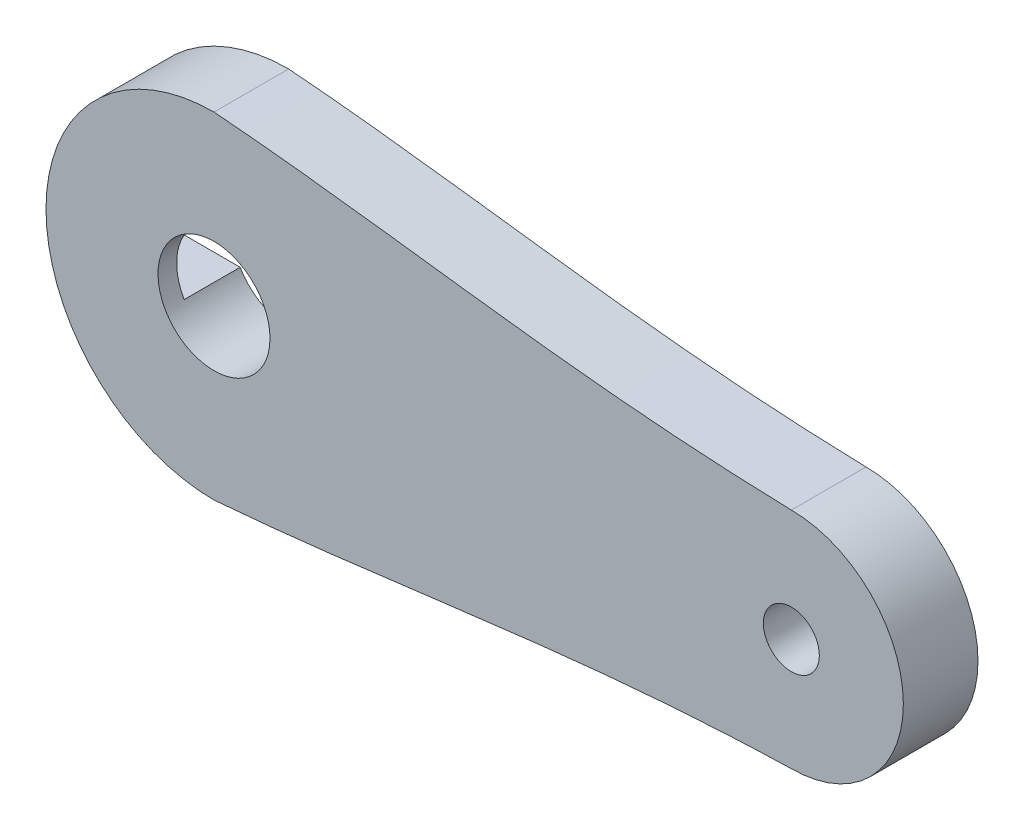
ISO-10303-21;
HEADER;
FILE_DESCRIPTION(('STEP AP214'),'2;1');
FILE_NAME('part.step','',(''),(''),'','','');
FILE_SCHEMA(('AUTOMOTIVE_DESIGN { 1 0 10303 214 1 1 1 1 }'));
ENDSEC;
DATA;
#1=APPLICATION_CONTEXT('core data for automotive mechanical design processes');
#2=APPLICATION_PROTOCOL_DEFINITION('international standard','automotive_design',2000,#1);
#3=PRODUCT_CONTEXT('',#1,'mechanical');
#4=PRODUCT('Part','Part','',(#3));
#5=PRODUCT_RELATED_PRODUCT_CATEGORY('part','',(#4));
#6=PRODUCT_DEFINITION_FORMATION('','',#4);
#7=PRODUCT_DEFINITION_CONTEXT('part definition',#1,'design');
#8=PRODUCT_DEFINITION('design','',#6,#7);
#9=PRODUCT_DEFINITION_SHAPE('','',#8);
#10=(LENGTH_UNIT() NAMED_UNIT(*) SI_UNIT(.MILLI.,.METRE.));
#11=(NAMED_UNIT(*) PLANE_ANGLE_UNIT() SI_UNIT($,.RADIAN.));
#12=(NAMED_UNIT(*) SI_UNIT($,.STERADIAN.) SOLID_ANGLE_UNIT());
#13=UNCERTAINTY_MEASURE_WITH_UNIT(LENGTH_MEASURE(1.E-05),#10,'distance_accuracy_value','');
#14=(GEOMETRIC_REPRESENTATION_CONTEXT(3) GLOBAL_UNCERTAINTY_ASSIGNED_CONTEXT((#13)) GLOBAL_UNIT_ASSIGNED_CONTEXT((#10,
#11,#12)) REPRESENTATION_CONTEXT('',''));
#15=CARTESIAN_POINT('',(0.,0.,0.));
#16=DIRECTION('',(0.,0.,1.));
#17=DIRECTION('',(1.,0.,0.));
#18=AXIS2_PLACEMENT_3D('',#15,#16,#17);
#19=CARTESIAN_POINT('',(14.6671745113369,7.31875759675215,0.));
#20=DIRECTION('',(0.,0.,1.));
#21=DIRECTION('',(1.,0.,0.));
#22=AXIS2_PLACEMENT_3D('',#19,#20,#21);
#23=PLANE('',#22);
#24=CARTESIAN_POINT('',(30.93,6.,0.));
#25=CARTESIAN_POINT('',(18.6898856465054,6.32824950480552,0.));
#26=CARTESIAN_POINT('',(10.1125797170595,8.18843741986687,0.));
#27=CARTESIAN_POINT('',(0.,9.,0.));
#28=B_SPLINE_CURVE_WITH_KNOTS('',3,(#24,#25,#26,#27),.UNSPECIFIED.,.F.,.F.,(4,4),(0.,1.),.UNSPECIFIED.);
#29=CARTESIAN_POINT('',(30.93,6.,0.));
#30=VERTEX_POINT('',#29);
#31=CARTESIAN_POINT('',(0.,9.,0.));
#32=VERTEX_POINT('',#31);
#33=EDGE_CURVE('E176',#30,#32,#28,.T.);
#34=ORIENTED_EDGE('',*,*,#33,.F.);
#35=CARTESIAN_POINT('',(30.93,0.,0.));
#36=DIRECTION('',(0.,0.,1.));
#37=DIRECTION('',(1.,0.,0.));
#38=AXIS2_PLACEMENT_3D('',#35,#36,#37);
#39=CIRCLE('',#38,6.);
#40=CARTESIAN_POINT('',(30.93,-6.,0.));
#41=VERTEX_POINT('',#40);
#42=EDGE_CURVE('E186',#41,#30,#39,.T.);
#43=ORIENTED_EDGE('',*,*,#42,.F.);
#44=CARTESIAN_POINT('',(0.,-9.,0.));
#45=CARTESIAN_POINT('',(10.1125797170595,-8.18843741986687,0.));
#46=CARTESIAN_POINT('',(18.6898856465054,-6.32824950480552,0.));
#47=CARTESIAN_POINT('',(30.93,-6.,0.));
#48=B_SPLINE_CURVE_WITH_KNOTS('',3,(#44,#45,#46,#47),.UNSPECIFIED.,.F.,.F.,(4,4),(0.,1.),.UNSPECIFIED.);
#49=CARTESIAN_POINT('',(0.,-9.,0.));
#50=VERTEX_POINT('',#49);
#51=EDGE_CURVE('E338',#50,#41,#48,.T.);
#52=ORIENTED_EDGE('',*,*,#51,.F.);
#53=CARTESIAN_POINT('',(0.,0.,0.));
#54=DIRECTION('',(0.,0.,1.));
#55=DIRECTION('',(1.,0.,0.));
#56=AXIS2_PLACEMENT_3D('',#53,#54,#55);
#57=CIRCLE('',#56,9.);
#58=EDGE_CURVE('E343',#32,#50,#57,.T.);
#59=ORIENTED_EDGE('',*,*,#58,.F.);
#60=EDGE_LOOP('',(#34,#43,#52,#59));
#61=FACE_BOUND('',#60,.T.);
#62=CARTESIAN_POINT('',(30.93,0.,0.));
#63=DIRECTION('',(0.,0.,1.));
#64=DIRECTION('',(1.,0.,0.));
#65=AXIS2_PLACEMENT_3D('',#62,#63,#64);
#66=CIRCLE('',#65,1.5);
#67=CARTESIAN_POINT('',(32.43,0.,0.));
#68=VERTEX_POINT('',#67);
#69=EDGE_CURVE('E137',#68,#68,#66,.T.);
#70=ORIENTED_EDGE('',*,*,#69,.T.);
#71=EDGE_LOOP('',(#70));
#72=FACE_BOUND('',#71,.T.);
#73=DIRECTION('',(-1.,0.,0.));
#74=VECTOR('',#73,1.);
#75=CARTESIAN_POINT('',(-2.59807621135333,1.5,0.));
#76=LINE('',#75,#74);
#77=CARTESIAN_POINT('',(-2.59807621135333,1.5,0.));
#78=VERTEX_POINT('',#77);
#79=CARTESIAN_POINT('',(-7.,1.5,0.));
#80=VERTEX_POINT('',#79);
#81=EDGE_CURVE('E154',#78,#80,#76,.T.);
#82=ORIENTED_EDGE('',*,*,#81,.T.);
#83=DIRECTION('',(0.,-1.,0.));
#84=VECTOR('',#83,1.);
#85=CARTESIAN_POINT('',(-7.,1.5,0.));
#86=LINE('',#85,#84);
#87=CARTESIAN_POINT('',(-7.,-1.5,0.));
#88=VERTEX_POINT('',#87);
#89=EDGE_CURVE('E135',#80,#88,#86,.T.);
#90=ORIENTED_EDGE('',*,*,#89,.T.);
#91=DIRECTION('',(1.,0.,0.));
#92=VECTOR('',#91,1.);
#93=CARTESIAN_POINT('',(-7.,-1.5,0.));
#94=LINE('',#93,#92);
#95=CARTESIAN_POINT('',(-2.59807621135333,-1.5,0.));
#96=VERTEX_POINT('',#95);
#97=EDGE_CURVE('E157',#88,#96,#94,.T.);
#98=ORIENTED_EDGE('',*,*,#97,.T.);
#99=CARTESIAN_POINT('',(0.,0.,0.));
#100=DIRECTION('',(0.,0.,1.));
#101=DIRECTION('',(1.,0.,0.));
#102=AXIS2_PLACEMENT_3D('',#99,#100,#101);
#103=CIRCLE('',#102,3.00000000000001);
#104=CARTESIAN_POINT('',(2.59807621135333,-1.5,0.));
#105=VERTEX_POINT('',#104);
#106=EDGE_CURVE('E170',#96,#105,#103,.T.);
#107=ORIENTED_EDGE('',*,*,#106,.T.);
#108=CARTESIAN_POINT('',(8.99999999999999,-1.5,0.));
#109=VERTEX_POINT('',#108);
#110=EDGE_CURVE('E156',#105,#109,#94,.T.);
#111=ORIENTED_EDGE('',*,*,#110,.T.);
#112=DIRECTION('',(0.,1.,0.));
#113=VECTOR('',#112,1.);
#114=CARTESIAN_POINT('',(8.99999999999999,-1.5,0.));
#115=LINE('',#114,#113);
#116=CARTESIAN_POINT('',(8.99999999999999,1.5,0.));
#117=VERTEX_POINT('',#116);
#118=EDGE_CURVE('E128',#109,#117,#115,.T.);
#119=ORIENTED_EDGE('',*,*,#118,.T.);
#120=CARTESIAN_POINT('',(2.59807621135333,1.5,0.));
#121=VERTEX_POINT('',#120);
#122=EDGE_CURVE('E151',#117,#121,#76,.T.);
#123=ORIENTED_EDGE('',*,*,#122,.T.);
#124=EDGE_CURVE('E177',#121,#78,#103,.T.);
#125=ORIENTED_EDGE('',*,*,#124,.T.);
#126=EDGE_LOOP('',(#82,#90,#98,#107,#111,#119,#123,#125));
#127=FACE_BOUND('',#126,.T.);
#128=ADVANCED_FACE('F34',(#61,#72,#127),#23,.F.);
#129=CARTESIAN_POINT('',(0.,0.,4.));
#130=DIRECTION('',(0.,0.,-1.));
#131=DIRECTION('',(-1.,0.,0.));
#132=AXIS2_PLACEMENT_3D('',#129,#130,#131);
#133=CYLINDRICAL_SURFACE('',#132,3.00000000000001);
#134=CARTESIAN_POINT('',(0.,0.,4.));
#135=DIRECTION('',(0.,0.,1.));
#136=DIRECTION('',(1.,0.,0.));
#137=AXIS2_PLACEMENT_3D('',#134,#135,#136);
#138=CIRCLE('',#137,3.00000000000001);
#139=CARTESIAN_POINT('',(3.00000000000001,0.,4.));
#140=VERTEX_POINT('',#139);
#141=EDGE_CURVE('E173',#140,#140,#138,.T.);
#142=ORIENTED_EDGE('',*,*,#141,.T.);
#143=EDGE_LOOP('',(#142));
#144=FACE_BOUND('',#143,.T.);
#145=CARTESIAN_POINT('',(0.,0.,3.));
#146=DIRECTION('',(0.,0.,1.));
#147=DIRECTION('',(1.,0.,0.));
#148=AXIS2_PLACEMENT_3D('',#145,#146,#147);
#149=CIRCLE('',#148,3.00000000000001);
#150=CARTESIAN_POINT('',(-2.59807621135333,1.5,3.));
#151=VERTEX_POINT('',#150);
#152=CARTESIAN_POINT('',(-2.59807621135333,-1.5,3.));
#153=VERTEX_POINT('',#152);
#154=EDGE_CURVE('E367',#151,#153,#149,.T.);
#155=ORIENTED_EDGE('',*,*,#154,.F.);
#156=DIRECTION('',(0.,0.,-1.));
#157=VECTOR('',#156,1.);
#158=CARTESIAN_POINT('',(-2.59807621135333,1.5,4.));
#159=LINE('',#158,#157);
#160=EDGE_CURVE('E11',#151,#78,#159,.T.);
#161=ORIENTED_EDGE('',*,*,#160,.T.);
#162=ORIENTED_EDGE('',*,*,#124,.F.);
#163=DIRECTION('',(0.,0.,-1.));
#164=VECTOR('',#163,1.);
#165=CARTESIAN_POINT('',(2.59807621135333,1.5,4.));
#166=LINE('',#165,#164);
#167=CARTESIAN_POINT('',(2.59807621135332,1.5,3.));
#168=VERTEX_POINT('',#167);
#169=EDGE_CURVE('E370',#121,#168,#166,.F.);
#170=ORIENTED_EDGE('',*,*,#169,.T.);
#171=CARTESIAN_POINT('',(2.59807621135333,-1.5,3.));
#172=VERTEX_POINT('',#171);
#173=EDGE_CURVE('E364',#172,#168,#149,.T.);
#174=ORIENTED_EDGE('',*,*,#173,.F.);
#175=DIRECTION('',(0.,0.,-1.));
#176=VECTOR('',#175,1.);
#177=CARTESIAN_POINT('',(2.59807621135333,-1.5,4.));
#178=LINE('',#177,#176);
#179=EDGE_CURVE('E366',#172,#105,#178,.T.);
#180=ORIENTED_EDGE('',*,*,#179,.T.);
#181=ORIENTED_EDGE('',*,*,#106,.F.);
#182=DIRECTION('',(0.,0.,-1.));
#183=VECTOR('',#182,1.);
#184=CARTESIAN_POINT('',(-2.59807621135333,-1.5,4.));
#185=LINE('',#184,#183);
#186=EDGE_CURVE('E43',#96,#153,#185,.F.);
#187=ORIENTED_EDGE('',*,*,#186,.T.);
#188=EDGE_LOOP('',(#155,#161,#162,#170,#174,#180,#181,#187));
#189=FACE_BOUND('',#188,.T.);
#190=ADVANCED_FACE('F217',(#144,#189),#133,.F.);
#191=CARTESIAN_POINT('',(14.6671745113369,7.31875759675215,4.));
#192=DIRECTION('',(0.,0.,1.));
#193=DIRECTION('',(1.,0.,0.));
#194=AXIS2_PLACEMENT_3D('',#191,#192,#193);
#195=PLANE('',#194);
#196=ORIENTED_EDGE('',*,*,#141,.F.);
#197=EDGE_LOOP('',(#196));
#198=FACE_BOUND('',#197,.T.);
#199=CARTESIAN_POINT('',(30.93,6.,4.));
#200=CARTESIAN_POINT('',(18.6898856465054,6.32824950480552,4.));
#201=CARTESIAN_POINT('',(10.1125797170595,8.18843741986687,4.));
#202=CARTESIAN_POINT('',(0.,9.,4.));
#203=B_SPLINE_CURVE_WITH_KNOTS('',3,(#199,#200,#201,#202),.UNSPECIFIED.,.F.,.F.,(4,4),(0.,1.),.UNSPECIFIED.);
#204=CARTESIAN_POINT('',(30.93,6.,4.));
#205=VERTEX_POINT('',#204);
#206=CARTESIAN_POINT('',(0.,9.,4.));
#207=VERTEX_POINT('',#206);
#208=EDGE_CURVE('E179',#205,#207,#203,.T.);
#209=ORIENTED_EDGE('',*,*,#208,.T.);
#210=CARTESIAN_POINT('',(0.,0.,4.));
#211=DIRECTION('',(0.,0.,1.));
#212=DIRECTION('',(1.,0.,0.));
#213=AXIS2_PLACEMENT_3D('',#210,#211,#212);
#214=CIRCLE('',#213,9.);
#215=CARTESIAN_POINT('',(0.,-9.,4.));
#216=VERTEX_POINT('',#215);
#217=EDGE_CURVE('E185',#207,#216,#214,.T.);
#218=ORIENTED_EDGE('',*,*,#217,.T.);
#219=CARTESIAN_POINT('',(0.,-9.,4.));
#220=CARTESIAN_POINT('',(10.1125797170595,-8.18843741986687,4.));
#221=CARTESIAN_POINT('',(18.6898856465054,-6.32824950480552,4.));
#222=CARTESIAN_POINT('',(30.93,-6.,4.));
#223=B_SPLINE_CURVE_WITH_KNOTS('',3,(#219,#220,#221,#222),.UNSPECIFIED.,.F.,.F.,(4,4),(0.,1.),.UNSPECIFIED.);
#224=CARTESIAN_POINT('',(30.93,-6.,4.));
#225=VERTEX_POINT('',#224);
#226=EDGE_CURVE('E191',#216,#225,#223,.T.);
#227=ORIENTED_EDGE('',*,*,#226,.T.);
#228=CARTESIAN_POINT('',(30.93,0.,4.));
#229=DIRECTION('',(0.,0.,1.));
#230=DIRECTION('',(1.,0.,0.));
#231=AXIS2_PLACEMENT_3D('',#228,#229,#230);
#232=CIRCLE('',#231,6.);
#233=EDGE_CURVE('E196',#225,#205,#232,.T.);
#234=ORIENTED_EDGE('',*,*,#233,.T.);
#235=EDGE_LOOP('',(#209,#218,#227,#234));
#236=FACE_BOUND('',#235,.T.);
#237=CARTESIAN_POINT('',(30.93,0.,4.));
#238=DIRECTION('',(0.,0.,1.));
#239=DIRECTION('',(1.,0.,0.));
#240=AXIS2_PLACEMENT_3D('',#237,#238,#239);
#241=CIRCLE('',#240,1.5);
#242=CARTESIAN_POINT('',(32.43,0.,4.));
#243=VERTEX_POINT('',#242);
#244=EDGE_CURVE('E167',#243,#243,#241,.T.);
#245=ORIENTED_EDGE('',*,*,#244,.F.);
#246=EDGE_LOOP('',(#245));
#247=FACE_BOUND('',#246,.T.);
#248=ADVANCED_FACE('F214',(#198,#236,#247),#195,.T.);
#249=DIRECTION('',(0.,0.,-1.));
#250=VECTOR('',#249,1.);
#251=SURFACE_OF_LINEAR_EXTRUSION('',#203,#250);
#252=ORIENTED_EDGE('',*,*,#33,.T.);
#253=DIRECTION('',(0.,0.,-1.));
#254=VECTOR('',#253,1.);
#255=CARTESIAN_POINT('',(0.,9.,4.));
#256=LINE('',#255,#254);
#257=EDGE_CURVE('E362',#207,#32,#256,.T.);
#258=ORIENTED_EDGE('',*,*,#257,.F.);
#259=ORIENTED_EDGE('',*,*,#208,.F.);
#260=DIRECTION('',(0.,0.,-1.));
#261=VECTOR('',#260,1.);
#262=CARTESIAN_POINT('',(30.93,6.,4.));
#263=LINE('',#262,#261);
#264=EDGE_CURVE('E333',#205,#30,#263,.T.);
#265=ORIENTED_EDGE('',*,*,#264,.T.);
#266=EDGE_LOOP('',(#252,#258,#259,#265));
#267=FACE_BOUND('',#266,.T.);
#268=ADVANCED_FACE('F36',(#267),#251,.F.);
#269=CARTESIAN_POINT('',(0.,0.,4.));
#270=DIRECTION('',(0.,0.,-1.));
#271=DIRECTION('',(-1.,0.,0.));
#272=AXIS2_PLACEMENT_3D('',#269,#270,#271);
#273=CYLINDRICAL_SURFACE('',#272,9.);
#274=ORIENTED_EDGE('',*,*,#58,.T.);
#275=DIRECTION('',(0.,0.,-1.));
#276=VECTOR('',#275,1.);
#277=CARTESIAN_POINT('',(0.,-9.,4.));
#278=LINE('',#277,#276);
#279=EDGE_CURVE('E359',#216,#50,#278,.T.);
#280=ORIENTED_EDGE('',*,*,#279,.F.);
#281=ORIENTED_EDGE('',*,*,#217,.F.);
#282=ORIENTED_EDGE('',*,*,#257,.T.);
#283=EDGE_LOOP('',(#274,#280,#281,#282));
#284=FACE_BOUND('',#283,.T.);
#285=ADVANCED_FACE('F206',(#284),#273,.T.);
#286=DIRECTION('',(0.,0.,-1.));
#287=VECTOR('',#286,1.);
#288=SURFACE_OF_LINEAR_EXTRUSION('',#223,#287);
#289=ORIENTED_EDGE('',*,*,#51,.T.);
#290=DIRECTION('',(0.,0.,-1.));
#291=VECTOR('',#290,1.);
#292=CARTESIAN_POINT('',(30.93,-6.,4.));
#293=LINE('',#292,#291);
#294=EDGE_CURVE('E336',#225,#41,#293,.T.);
#295=ORIENTED_EDGE('',*,*,#294,.F.);
#296=ORIENTED_EDGE('',*,*,#226,.F.);
#297=ORIENTED_EDGE('',*,*,#279,.T.);
#298=EDGE_LOOP('',(#289,#295,#296,#297));
#299=FACE_BOUND('',#298,.T.);
#300=ADVANCED_FACE('F202',(#299),#288,.F.);
#301=CARTESIAN_POINT('',(30.93,0.,4.));
#302=DIRECTION('',(0.,0.,-1.));
#303=DIRECTION('',(-1.,0.,0.));
#304=AXIS2_PLACEMENT_3D('',#301,#302,#303);
#305=CYLINDRICAL_SURFACE('',#304,6.);
#306=ORIENTED_EDGE('',*,*,#42,.T.);
#307=ORIENTED_EDGE('',*,*,#264,.F.);
#308=ORIENTED_EDGE('',*,*,#233,.F.);
#309=ORIENTED_EDGE('',*,*,#294,.T.);
#310=EDGE_LOOP('',(#306,#307,#308,#309));
#311=FACE_BOUND('',#310,.T.);
#312=ADVANCED_FACE('F205',(#311),#305,.T.);
#313=CARTESIAN_POINT('',(30.93,0.,4.));
#314=DIRECTION('',(0.,0.,-1.));
#315=DIRECTION('',(-1.,0.,0.));
#316=AXIS2_PLACEMENT_3D('',#313,#314,#315);
#317=CYLINDRICAL_SURFACE('',#316,1.5);
#318=ORIENTED_EDGE('',*,*,#244,.T.);
#319=EDGE_LOOP('',(#318));
#320=FACE_BOUND('',#319,.T.);
#321=ORIENTED_EDGE('',*,*,#69,.F.);
#322=EDGE_LOOP('',(#321));
#323=FACE_BOUND('',#322,.T.);
#324=ADVANCED_FACE('F230',(#320,#323),#317,.F.);
#325=CARTESIAN_POINT('',(0.,0.,3.));
#326=DIRECTION('',(0.,0.,1.));
#327=DIRECTION('',(1.,0.,0.));
#328=AXIS2_PLACEMENT_3D('',#325,#326,#327);
#329=PLANE('',#328);
#330=ORIENTED_EDGE('',*,*,#173,.T.);
#331=DIRECTION('',(-1.,0.,0.));
#332=VECTOR('',#331,1.);
#333=CARTESIAN_POINT('',(8.99999999999999,1.5,3.));
#334=LINE('',#333,#332);
#335=CARTESIAN_POINT('',(8.99999999999999,1.5,3.));
#336=VERTEX_POINT('',#335);
#337=EDGE_CURVE('E127',#336,#168,#334,.T.);
#338=ORIENTED_EDGE('',*,*,#337,.F.);
#339=DIRECTION('',(0.,1.,0.));
#340=VECTOR('',#339,1.);
#341=CARTESIAN_POINT('',(8.99999999999999,-1.5,3.));
#342=LINE('',#341,#340);
#343=CARTESIAN_POINT('',(8.99999999999999,-1.5,3.));
#344=VERTEX_POINT('',#343);
#345=EDGE_CURVE('E148',#344,#336,#342,.T.);
#346=ORIENTED_EDGE('',*,*,#345,.F.);
#347=DIRECTION('',(1.,0.,0.));
#348=VECTOR('',#347,1.);
#349=CARTESIAN_POINT('',(-7.,-1.5,3.));
#350=LINE('',#349,#348);
#351=EDGE_CURVE('E58',#172,#344,#350,.T.);
#352=ORIENTED_EDGE('',*,*,#351,.F.);
#353=EDGE_LOOP('',(#330,#338,#346,#352));
#354=FACE_BOUND('',#353,.T.);
#355=ADVANCED_FACE('F233',(#354),#329,.F.);
#356=CARTESIAN_POINT('',(-7.,-1.5,3.));
#357=DIRECTION('',(0.,1.,0.));
#358=DIRECTION('',(0.,0.,1.));
#359=AXIS2_PLACEMENT_3D('',#356,#357,#358);
#360=PLANE('',#359);
#361=ORIENTED_EDGE('',*,*,#351,.T.);
#362=DIRECTION('',(0.,0.,-1.));
#363=VECTOR('',#362,1.);
#364=CARTESIAN_POINT('',(8.99999999999999,-1.5,3.));
#365=LINE('',#364,#363);
#366=EDGE_CURVE('E164',#344,#109,#365,.T.);
#367=ORIENTED_EDGE('',*,*,#366,.T.);
#368=ORIENTED_EDGE('',*,*,#110,.F.);
#369=ORIENTED_EDGE('',*,*,#179,.F.);
#370=EDGE_LOOP('',(#361,#367,#368,#369));
#371=FACE_BOUND('',#370,.T.);
#372=ADVANCED_FACE('F239',(#371),#360,.T.);
#373=CARTESIAN_POINT('',(-2.59807621135333,1.5,3.));
#374=DIRECTION('',(0.,-1.,0.));
#375=DIRECTION('',(0.,0.,-1.));
#376=AXIS2_PLACEMENT_3D('',#373,#374,#375);
#377=PLANE('',#376);
#378=ORIENTED_EDGE('',*,*,#122,.F.);
#379=DIRECTION('',(0.,0.,-1.));
#380=VECTOR('',#379,1.);
#381=CARTESIAN_POINT('',(8.99999999999999,1.5,3.));
#382=LINE('',#381,#380);
#383=EDGE_CURVE('E150',#336,#117,#382,.T.);
#384=ORIENTED_EDGE('',*,*,#383,.F.);
#385=ORIENTED_EDGE('',*,*,#337,.T.);
#386=ORIENTED_EDGE('',*,*,#169,.F.);
#387=EDGE_LOOP('',(#378,#384,#385,#386));
#388=FACE_BOUND('',#387,.T.);
#389=ADVANCED_FACE('F235',(#388),#377,.T.);
#390=CARTESIAN_POINT('',(8.99999999999999,-1.5,3.));
#391=DIRECTION('',(-1.,0.,0.));
#392=DIRECTION('',(0.,0.,1.));
#393=AXIS2_PLACEMENT_3D('',#390,#391,#392);
#394=PLANE('',#393);
#395=ORIENTED_EDGE('',*,*,#118,.F.);
#396=ORIENTED_EDGE('',*,*,#366,.F.);
#397=ORIENTED_EDGE('',*,*,#345,.T.);
#398=ORIENTED_EDGE('',*,*,#383,.T.);
#399=EDGE_LOOP('',(#395,#396,#397,#398));
#400=FACE_BOUND('',#399,.T.);
#401=ADVANCED_FACE('F238',(#400),#394,.T.);
#402=CARTESIAN_POINT('',(-7.,1.5,3.));
#403=VERTEX_POINT('',#402);
#404=EDGE_CURVE('E50',#151,#403,#334,.T.);
#405=ORIENTED_EDGE('',*,*,#404,.T.);
#406=DIRECTION('',(0.,0.,-1.));
#407=VECTOR('',#406,1.);
#408=CARTESIAN_POINT('',(-7.,1.5,3.));
#409=LINE('',#408,#407);
#410=EDGE_CURVE('E124',#403,#80,#409,.T.);
#411=ORIENTED_EDGE('',*,*,#410,.T.);
#412=ORIENTED_EDGE('',*,*,#81,.F.);
#413=ORIENTED_EDGE('',*,*,#160,.F.);
#414=EDGE_LOOP('',(#405,#411,#412,#413));
#415=FACE_BOUND('',#414,.T.);
#416=ADVANCED_FACE('F123',(#415),#377,.T.);
#417=ORIENTED_EDGE('',*,*,#154,.T.);
#418=CARTESIAN_POINT('',(-7.,-1.5,3.));
#419=VERTEX_POINT('',#418);
#420=EDGE_CURVE('E143',#419,#153,#350,.T.);
#421=ORIENTED_EDGE('',*,*,#420,.F.);
#422=DIRECTION('',(0.,-1.,0.));
#423=VECTOR('',#422,1.);
#424=CARTESIAN_POINT('',(-7.,1.5,3.));
#425=LINE('',#424,#423);
#426=EDGE_CURVE('E132',#403,#419,#425,.T.);
#427=ORIENTED_EDGE('',*,*,#426,.F.);
#428=ORIENTED_EDGE('',*,*,#404,.F.);
#429=EDGE_LOOP('',(#417,#421,#427,#428));
#430=FACE_BOUND('',#429,.T.);
#431=ADVANCED_FACE('F141',(#430),#329,.F.);
#432=CARTESIAN_POINT('',(-7.,1.5,3.));
#433=DIRECTION('',(1.,0.,0.));
#434=DIRECTION('',(0.,0.,-1.));
#435=AXIS2_PLACEMENT_3D('',#432,#433,#434);
#436=PLANE('',#435);
#437=ORIENTED_EDGE('',*,*,#89,.F.);
#438=ORIENTED_EDGE('',*,*,#410,.F.);
#439=ORIENTED_EDGE('',*,*,#426,.T.);
#440=DIRECTION('',(0.,0.,-1.));
#441=VECTOR('',#440,1.);
#442=CARTESIAN_POINT('',(-7.,-1.5,3.));
#443=LINE('',#442,#441);
#444=EDGE_CURVE('E138',#419,#88,#443,.T.);
#445=ORIENTED_EDGE('',*,*,#444,.T.);
#446=EDGE_LOOP('',(#437,#438,#439,#445));
#447=FACE_BOUND('',#446,.T.);
#448=ADVANCED_FACE('F131',(#447),#436,.T.);
#449=ORIENTED_EDGE('',*,*,#97,.F.);
#450=ORIENTED_EDGE('',*,*,#444,.F.);
#451=ORIENTED_EDGE('',*,*,#420,.T.);
#452=ORIENTED_EDGE('',*,*,#186,.F.);
#453=EDGE_LOOP('',(#449,#450,#451,#452));
#454=FACE_BOUND('',#453,.T.);
#455=ADVANCED_FACE('F243',(#454),#360,.T.);
#456=CLOSED_SHELL('',(#128,#190,#248,#268,#285,#300,#312,#324,#355,#372,#389,#401,#416,#431,
#448,#455));
#457=MANIFOLD_SOLID_BREP('B2',#456);
#458=ADVANCED_BREP_SHAPE_REPRESENTATION('',(#18,#457),#14);
#459=SHAPE_DEFINITION_REPRESENTATION(#9,#458);
ENDSEC;
END-ISO-10303-21;
